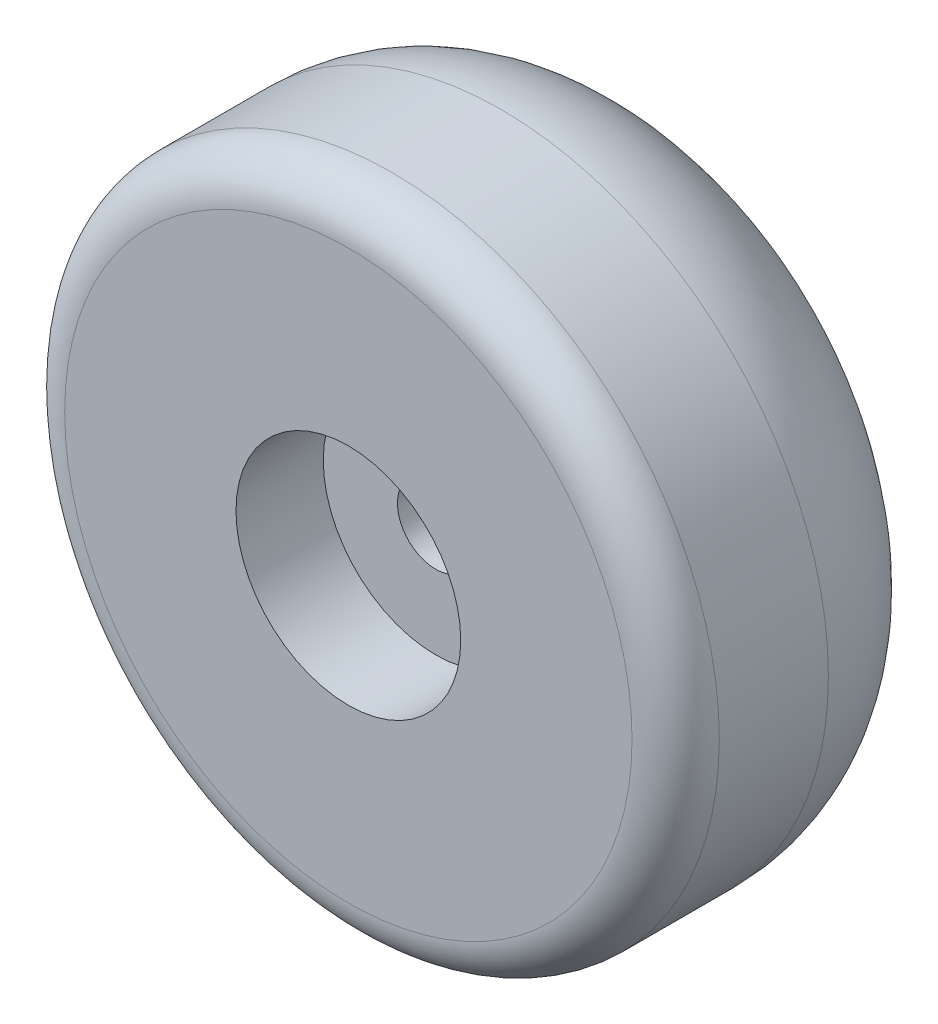
ISO-10303-21;
HEADER;
FILE_DESCRIPTION(('STEP AP214'),'2;1');
FILE_NAME('part.step','',(''),(''),'','','');
FILE_SCHEMA(('AUTOMOTIVE_DESIGN { 1 0 10303 214 1 1 1 1 }'));
ENDSEC;
DATA;
#1=APPLICATION_CONTEXT('core data for automotive mechanical design processes');
#2=APPLICATION_PROTOCOL_DEFINITION('international standard','automotive_design',2000,#1);
#3=PRODUCT_CONTEXT('',#1,'mechanical');
#4=PRODUCT('Part','Part','',(#3));
#5=PRODUCT_RELATED_PRODUCT_CATEGORY('part','',(#4));
#6=PRODUCT_DEFINITION_FORMATION('','',#4);
#7=PRODUCT_DEFINITION_CONTEXT('part definition',#1,'design');
#8=PRODUCT_DEFINITION('design','',#6,#7);
#9=PRODUCT_DEFINITION_SHAPE('','',#8);
#10=(LENGTH_UNIT() NAMED_UNIT(*) SI_UNIT(.MILLI.,.METRE.));
#11=(NAMED_UNIT(*) PLANE_ANGLE_UNIT() SI_UNIT($,.RADIAN.));
#12=(NAMED_UNIT(*) SI_UNIT($,.STERADIAN.) SOLID_ANGLE_UNIT());
#13=UNCERTAINTY_MEASURE_WITH_UNIT(LENGTH_MEASURE(1.E-05),#10,'distance_accuracy_value','');
#14=(GEOMETRIC_REPRESENTATION_CONTEXT(3) GLOBAL_UNCERTAINTY_ASSIGNED_CONTEXT((#13)) GLOBAL_UNIT_ASSIGNED_CONTEXT((#10,
#11,#12)) REPRESENTATION_CONTEXT('',''));
#15=CARTESIAN_POINT('',(0.,0.,0.));
#16=DIRECTION('',(0.,0.,1.));
#17=DIRECTION('',(1.,0.,0.));
#18=AXIS2_PLACEMENT_3D('',#15,#16,#17);
#19=CARTESIAN_POINT('',(0.,0.,14.));
#20=DIRECTION('',(0.,0.,-1.));
#21=DIRECTION('',(-1.,0.,0.));
#22=AXIS2_PLACEMENT_3D('',#19,#20,#21);
#23=CYLINDRICAL_SURFACE('',#22,1.75);
#24=CARTESIAN_POINT('',(0.,0.,0.));
#25=DIRECTION('',(0.,0.,1.));
#26=DIRECTION('',(1.,0.,0.));
#27=AXIS2_PLACEMENT_3D('',#24,#25,#26);
#28=CIRCLE('',#27,1.75);
#29=CARTESIAN_POINT('',(1.75,0.,0.));
#30=VERTEX_POINT('',#29);
#31=EDGE_CURVE('E51',#30,#30,#28,.T.);
#32=ORIENTED_EDGE('',*,*,#31,.F.);
#33=EDGE_LOOP('',(#32));
#34=FACE_BOUND('',#33,.T.);
#35=CARTESIAN_POINT('',(0.,0.,10.));
#36=DIRECTION('',(0.,0.,1.));
#37=DIRECTION('',(1.,0.,0.));
#38=AXIS2_PLACEMENT_3D('',#35,#36,#37);
#39=CIRCLE('',#38,1.75);
#40=CARTESIAN_POINT('',(1.75,0.,10.));
#41=VERTEX_POINT('',#40);
#42=EDGE_CURVE('E52',#41,#41,#39,.T.);
#43=ORIENTED_EDGE('',*,*,#42,.T.);
#44=EDGE_LOOP('',(#43));
#45=FACE_BOUND('',#44,.T.);
#46=ADVANCED_FACE('F31',(#34,#45),#23,.F.);
#47=CARTESIAN_POINT('',(0.,0.,14.));
#48=DIRECTION('',(0.,0.,1.));
#49=DIRECTION('',(1.,0.,0.));
#50=AXIS2_PLACEMENT_3D('',#47,#48,#49);
#51=PLANE('',#50);
#52=CARTESIAN_POINT('',(0.,0.,14.));
#53=DIRECTION('',(0.,0.,1.));
#54=DIRECTION('',(1.,0.,0.));
#55=AXIS2_PLACEMENT_3D('',#52,#53,#54);
#56=CIRCLE('',#55,13.);
#57=CARTESIAN_POINT('',(13.,0.,14.));
#58=VERTEX_POINT('',#57);
#59=EDGE_CURVE('E46',#58,#58,#56,.T.);
#60=ORIENTED_EDGE('',*,*,#59,.T.);
#61=EDGE_LOOP('',(#60));
#62=FACE_BOUND('',#61,.T.);
#63=CARTESIAN_POINT('',(0.,0.,14.));
#64=DIRECTION('',(0.,0.,1.));
#65=DIRECTION('',(1.,0.,0.));
#66=AXIS2_PLACEMENT_3D('',#63,#64,#65);
#67=CIRCLE('',#66,5.15);
#68=CARTESIAN_POINT('',(5.15,0.,14.));
#69=VERTEX_POINT('',#68);
#70=EDGE_CURVE('E58',#69,#69,#67,.T.);
#71=ORIENTED_EDGE('',*,*,#70,.F.);
#72=EDGE_LOOP('',(#71));
#73=FACE_BOUND('',#72,.T.);
#74=ADVANCED_FACE('F73',(#62,#73),#51,.T.);
#75=CARTESIAN_POINT('',(0.,0.,0.));
#76=DIRECTION('',(0.,0.,1.));
#77=DIRECTION('',(1.,0.,0.));
#78=AXIS2_PLACEMENT_3D('',#75,#76,#77);
#79=PLANE('',#78);
#80=CARTESIAN_POINT('',(0.,0.,0.));
#81=DIRECTION('',(0.,0.,1.));
#82=DIRECTION('',(1.,0.,0.));
#83=AXIS2_PLACEMENT_3D('',#80,#81,#82);
#84=CIRCLE('',#83,8.);
#85=CARTESIAN_POINT('',(8.,0.,0.));
#86=VERTEX_POINT('',#85);
#87=EDGE_CURVE('E10',#86,#86,#84,.F.);
#88=ORIENTED_EDGE('',*,*,#87,.T.);
#89=EDGE_LOOP('',(#88));
#90=FACE_BOUND('',#89,.T.);
#91=ORIENTED_EDGE('',*,*,#31,.T.);
#92=EDGE_LOOP('',(#91));
#93=FACE_BOUND('',#92,.T.);
#94=ADVANCED_FACE('F75',(#90,#93),#79,.F.);
#95=CARTESIAN_POINT('',(0.,0.,14.));
#96=DIRECTION('',(0.,0.,-1.));
#97=DIRECTION('',(-1.,0.,0.));
#98=AXIS2_PLACEMENT_3D('',#95,#96,#97);
#99=CYLINDRICAL_SURFACE('',#98,15.);
#100=CARTESIAN_POINT('',(0.,0.,7.));
#101=DIRECTION('',(0.,0.,1.));
#102=DIRECTION('',(1.,0.,0.));
#103=AXIS2_PLACEMENT_3D('',#100,#101,#102);
#104=CIRCLE('',#103,15.);
#105=CARTESIAN_POINT('',(15.,0.,7.));
#106=VERTEX_POINT('',#105);
#107=EDGE_CURVE('E38',#106,#106,#104,.T.);
#108=ORIENTED_EDGE('',*,*,#107,.T.);
#109=EDGE_LOOP('',(#108));
#110=FACE_BOUND('',#109,.T.);
#111=CARTESIAN_POINT('',(0.,0.,12.));
#112=DIRECTION('',(0.,0.,1.));
#113=DIRECTION('',(1.,0.,0.));
#114=AXIS2_PLACEMENT_3D('',#111,#112,#113);
#115=CIRCLE('',#114,15.);
#116=CARTESIAN_POINT('',(15.,0.,12.));
#117=VERTEX_POINT('',#116);
#118=EDGE_CURVE('E42',#117,#117,#115,.F.);
#119=ORIENTED_EDGE('',*,*,#118,.T.);
#120=EDGE_LOOP('',(#119));
#121=FACE_BOUND('',#120,.T.);
#122=ADVANCED_FACE('F69',(#110,#121),#99,.T.);
#123=CARTESIAN_POINT('',(0.,0.,10.));
#124=DIRECTION('',(0.,0.,1.));
#125=DIRECTION('',(1.,0.,0.));
#126=AXIS2_PLACEMENT_3D('',#123,#124,#125);
#127=CYLINDRICAL_SURFACE('',#126,5.15);
#128=CARTESIAN_POINT('',(0.,0.,10.));
#129=DIRECTION('',(0.,0.,1.));
#130=DIRECTION('',(1.,0.,0.));
#131=AXIS2_PLACEMENT_3D('',#128,#129,#130);
#132=CIRCLE('',#131,5.15);
#133=CARTESIAN_POINT('',(5.15,0.,10.));
#134=VERTEX_POINT('',#133);
#135=EDGE_CURVE('E55',#134,#134,#132,.T.);
#136=ORIENTED_EDGE('',*,*,#135,.F.);
#137=EDGE_LOOP('',(#136));
#138=FACE_BOUND('',#137,.T.);
#139=ORIENTED_EDGE('',*,*,#70,.T.);
#140=EDGE_LOOP('',(#139));
#141=FACE_BOUND('',#140,.T.);
#142=ADVANCED_FACE('F66',(#138,#141),#127,.F.);
#143=CARTESIAN_POINT('',(0.,0.,10.));
#144=DIRECTION('',(0.,0.,1.));
#145=DIRECTION('',(1.,0.,0.));
#146=AXIS2_PLACEMENT_3D('',#143,#144,#145);
#147=PLANE('',#146);
#148=ORIENTED_EDGE('',*,*,#42,.F.);
#149=EDGE_LOOP('',(#148));
#150=FACE_BOUND('',#149,.T.);
#151=ORIENTED_EDGE('',*,*,#135,.T.);
#152=EDGE_LOOP('',(#151));
#153=FACE_BOUND('',#152,.T.);
#154=ADVANCED_FACE('F64',(#150,#153),#147,.T.);
#155=CARTESIAN_POINT('',(0.,0.,12.));
#156=DIRECTION('',(0.,0.,1.));
#157=DIRECTION('',(1.,0.,0.));
#158=AXIS2_PLACEMENT_3D('',#155,#156,#157);
#159=TOROIDAL_SURFACE('',#158,13.,2.);
#160=ORIENTED_EDGE('',*,*,#118,.F.);
#161=EDGE_LOOP('',(#160));
#162=FACE_BOUND('',#161,.T.);
#163=ORIENTED_EDGE('',*,*,#59,.F.);
#164=EDGE_LOOP('',(#163));
#165=FACE_BOUND('',#164,.T.);
#166=ADVANCED_FACE('F87',(#162,#165),#159,.T.);
#167=CARTESIAN_POINT('',(0.,0.,7.));
#168=DIRECTION('',(0.,0.,1.));
#169=DIRECTION('',(1.,0.,0.));
#170=AXIS2_PLACEMENT_3D('',#167,#168,#169);
#171=TOROIDAL_SURFACE('',#170,8.,7.);
#172=ORIENTED_EDGE('',*,*,#87,.F.);
#173=EDGE_LOOP('',(#172));
#174=FACE_BOUND('',#173,.T.);
#175=ORIENTED_EDGE('',*,*,#107,.F.);
#176=EDGE_LOOP('',(#175));
#177=FACE_BOUND('',#176,.T.);
#178=ADVANCED_FACE('F33',(#174,#177),#171,.T.);
#179=CLOSED_SHELL('',(#46,#74,#94,#122,#142,#154,#166,#178));
#180=MANIFOLD_SOLID_BREP('B2',#179);
#181=ADVANCED_BREP_SHAPE_REPRESENTATION('',(#18,#180),#14);
#182=SHAPE_DEFINITION_REPRESENTATION(#9,#181);
ENDSEC;
END-ISO-10303-21;
